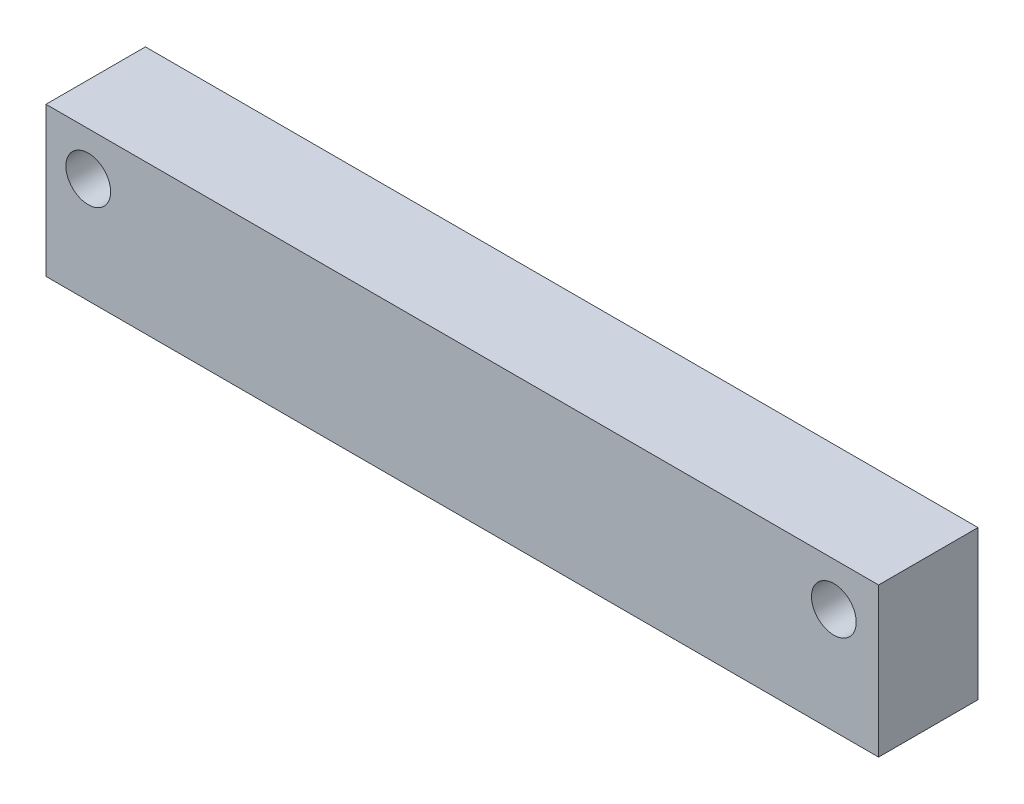
ISO-10303-21;
HEADER;
FILE_DESCRIPTION(('STEP AP214'),'2;1');
FILE_NAME('part.step','',(''),(''),'','','');
FILE_SCHEMA(('AUTOMOTIVE_DESIGN { 1 0 10303 214 1 1 1 1 }'));
ENDSEC;
DATA;
#1=APPLICATION_CONTEXT('core data for automotive mechanical design processes');
#2=APPLICATION_PROTOCOL_DEFINITION('international standard','automotive_design',2000,#1);
#3=PRODUCT_CONTEXT('',#1,'mechanical');
#4=PRODUCT('Part','Part','',(#3));
#5=PRODUCT_RELATED_PRODUCT_CATEGORY('part','',(#4));
#6=PRODUCT_DEFINITION_FORMATION('','',#4);
#7=PRODUCT_DEFINITION_CONTEXT('part definition',#1,'design');
#8=PRODUCT_DEFINITION('design','',#6,#7);
#9=PRODUCT_DEFINITION_SHAPE('','',#8);
#10=(LENGTH_UNIT() NAMED_UNIT(*) SI_UNIT(.MILLI.,.METRE.));
#11=(NAMED_UNIT(*) PLANE_ANGLE_UNIT() SI_UNIT($,.RADIAN.));
#12=(NAMED_UNIT(*) SI_UNIT($,.STERADIAN.) SOLID_ANGLE_UNIT());
#13=UNCERTAINTY_MEASURE_WITH_UNIT(LENGTH_MEASURE(1.E-05),#10,'distance_accuracy_value','');
#14=(GEOMETRIC_REPRESENTATION_CONTEXT(3) GLOBAL_UNCERTAINTY_ASSIGNED_CONTEXT((#13)) GLOBAL_UNIT_ASSIGNED_CONTEXT((#10,
#11,#12)) REPRESENTATION_CONTEXT('',''));
#15=CARTESIAN_POINT('',(0.,0.,0.));
#16=DIRECTION('',(0.,0.,1.));
#17=DIRECTION('',(1.,0.,0.));
#18=AXIS2_PLACEMENT_3D('',#15,#16,#17);
#19=CARTESIAN_POINT('',(0.,38.5000000000009,76.0661442683266));
#20=DIRECTION('',(0.,1.,0.));
#21=DIRECTION('',(0.,0.,1.));
#22=AXIS2_PLACEMENT_3D('',#19,#20,#21);
#23=PLANE('',#22);
#24=DIRECTION('',(1.,0.,-3.19999867644664E-09));
#25=VECTOR('',#24,1.);
#26=CARTESIAN_POINT('',(-2.17811570641216E-07,38.5000000000009,8.00000029007987));
#27=LINE('',#26,#25);
#28=CARTESIAN_POINT('',(67.3500000304,38.5000000000009,8.00000007455997));
#29=VERTEX_POINT('',#28);
#30=CARTESIAN_POINT('',(134.3500000304,38.5000000000009,7.99999986016006));
#31=VERTEX_POINT('',#30);
#32=EDGE_CURVE('E98',#29,#31,#27,.T.);
#33=ORIENTED_EDGE('',*,*,#32,.F.);
#34=DIRECTION('',(0.,0.,-1.));
#35=VECTOR('',#34,1.);
#36=CARTESIAN_POINT('',(67.3500000304,38.5000000000009,76.0661442683266));
#37=LINE('',#36,#35);
#38=CARTESIAN_POINT('',(67.3500000304,38.5000000000009,0.));
#39=VERTEX_POINT('',#38);
#40=EDGE_CURVE('E51',#29,#39,#37,.T.);
#41=ORIENTED_EDGE('',*,*,#40,.T.);
#42=DIRECTION('',(1.,0.,0.));
#43=VECTOR('',#42,1.);
#44=CARTESIAN_POINT('',(0.,38.5000000000009,0.));
#45=LINE('',#44,#43);
#46=CARTESIAN_POINT('',(134.3500000304,38.5000000000009,0.));
#47=VERTEX_POINT('',#46);
#48=EDGE_CURVE('E96',#39,#47,#45,.T.);
#49=ORIENTED_EDGE('',*,*,#48,.T.);
#50=DIRECTION('',(0.,0.,-1.));
#51=VECTOR('',#50,1.);
#52=CARTESIAN_POINT('',(134.3500000304,38.5000000000009,76.0661442683266));
#53=LINE('',#52,#51);
#54=EDGE_CURVE('E87',#31,#47,#53,.T.);
#55=ORIENTED_EDGE('',*,*,#54,.F.);
#56=EDGE_LOOP('',(#33,#41,#49,#55));
#57=FACE_BOUND('',#56,.T.);
#58=ADVANCED_FACE('F47',(#57),#23,.F.);
#59=CARTESIAN_POINT('',(134.3500000304,0.,76.0661442683266));
#60=DIRECTION('',(-1.,0.,0.));
#61=DIRECTION('',(0.,0.,1.));
#62=AXIS2_PLACEMENT_3D('',#59,#60,#61);
#63=PLANE('',#62);
#64=DIRECTION('',(0.,1.,0.));
#65=VECTOR('',#64,1.);
#66=CARTESIAN_POINT('',(134.3500000304,0.,7.99999986016003));
#67=LINE('',#66,#65);
#68=CARTESIAN_POINT('',(134.3500000304,50.5000000000009,7.99999996736002));
#69=VERTEX_POINT('',#68);
#70=EDGE_CURVE('E57',#31,#69,#67,.T.);
#71=ORIENTED_EDGE('',*,*,#70,.F.);
#72=ORIENTED_EDGE('',*,*,#54,.T.);
#73=DIRECTION('',(0.,1.,0.));
#74=VECTOR('',#73,1.);
#75=CARTESIAN_POINT('',(134.3500000304,0.,0.));
#76=LINE('',#75,#74);
#77=CARTESIAN_POINT('',(134.3500000304,50.5000000000009,0.));
#78=VERTEX_POINT('',#77);
#79=EDGE_CURVE('E111',#47,#78,#76,.T.);
#80=ORIENTED_EDGE('',*,*,#79,.T.);
#81=DIRECTION('',(0.,0.,-1.));
#82=VECTOR('',#81,1.);
#83=CARTESIAN_POINT('',(134.3500000304,50.5000000000009,76.0661442683266));
#84=LINE('',#83,#82);
#85=EDGE_CURVE('E126',#69,#78,#84,.T.);
#86=ORIENTED_EDGE('',*,*,#85,.F.);
#87=EDGE_LOOP('',(#71,#72,#80,#86));
#88=FACE_BOUND('',#87,.T.);
#89=ADVANCED_FACE('F157',(#88),#63,.F.);
#90=CARTESIAN_POINT('',(0.,50.5000000000009,76.0661442683266));
#91=DIRECTION('',(0.,-1.,0.));
#92=DIRECTION('',(0.,0.,-1.));
#93=AXIS2_PLACEMENT_3D('',#90,#91,#92);
#94=PLANE('',#93);
#95=DIRECTION('',(-1.,0.,3.19999867644664E-09));
#96=VECTOR('',#95,1.);
#97=CARTESIAN_POINT('',(-2.17811570641216E-07,50.5000000000009,8.00000029007988));
#98=LINE('',#97,#96);
#99=CARTESIAN_POINT('',(67.3500000304,50.5000000000009,8.00000007455998));
#100=VERTEX_POINT('',#99);
#101=EDGE_CURVE('E11',#69,#100,#98,.T.);
#102=ORIENTED_EDGE('',*,*,#101,.F.);
#103=ORIENTED_EDGE('',*,*,#85,.T.);
#104=DIRECTION('',(-1.,0.,0.));
#105=VECTOR('',#104,1.);
#106=CARTESIAN_POINT('',(0.,50.5000000000009,0.));
#107=LINE('',#106,#105);
#108=CARTESIAN_POINT('',(67.3500000304,50.5000000000009,0.));
#109=VERTEX_POINT('',#108);
#110=EDGE_CURVE('E128',#78,#109,#107,.T.);
#111=ORIENTED_EDGE('',*,*,#110,.T.);
#112=DIRECTION('',(0.,0.,-1.));
#113=VECTOR('',#112,1.);
#114=CARTESIAN_POINT('',(67.3500000304,50.5000000000009,76.0661442683266));
#115=LINE('',#114,#113);
#116=EDGE_CURVE('E70',#100,#109,#115,.T.);
#117=ORIENTED_EDGE('',*,*,#116,.F.);
#118=EDGE_LOOP('',(#102,#103,#111,#117));
#119=FACE_BOUND('',#118,.T.);
#120=ADVANCED_FACE('F156',(#119),#94,.F.);
#121=CARTESIAN_POINT('',(67.3500000304,0.,76.0661442683266));
#122=DIRECTION('',(1.,0.,0.));
#123=DIRECTION('',(0.,0.,-1.));
#124=AXIS2_PLACEMENT_3D('',#121,#122,#123);
#125=PLANE('',#124);
#126=DIRECTION('',(0.,-1.,0.));
#127=VECTOR('',#126,1.);
#128=CARTESIAN_POINT('',(67.3500000304,0.,8.00000007455995));
#129=LINE('',#128,#127);
#130=EDGE_CURVE('E108',#100,#29,#129,.T.);
#131=ORIENTED_EDGE('',*,*,#130,.F.);
#132=ORIENTED_EDGE('',*,*,#116,.T.);
#133=DIRECTION('',(0.,-1.,0.));
#134=VECTOR('',#133,1.);
#135=CARTESIAN_POINT('',(67.3500000304,0.,0.));
#136=LINE('',#135,#134);
#137=EDGE_CURVE('E103',#109,#39,#136,.T.);
#138=ORIENTED_EDGE('',*,*,#137,.T.);
#139=ORIENTED_EDGE('',*,*,#40,.F.);
#140=EDGE_LOOP('',(#131,#132,#138,#139));
#141=FACE_BOUND('',#140,.T.);
#142=ADVANCED_FACE('F104',(#141),#125,.F.);
#143=CARTESIAN_POINT('',(0.,0.,0.));
#144=DIRECTION('',(0.,0.,1.));
#145=DIRECTION('',(1.,0.,0.));
#146=AXIS2_PLACEMENT_3D('',#143,#144,#145);
#147=PLANE('',#146);
#148=CARTESIAN_POINT('',(70.7500000159984,47.0000000000009,-1.08799982911911E-08));
#149=DIRECTION('',(3.19999867644664E-09,0.,1.));
#150=DIRECTION('',(1.,0.,-3.19999867644664E-09));
#151=AXIS2_PLACEMENT_3D('',#148,#149,#150);
#152=CIRCLE('',#151,1.8);
#153=CARTESIAN_POINT('',(72.5500000159984,47.0000000000009,-1.66399959087951E-08));
#154=VERTEX_POINT('',#153);
#155=EDGE_CURVE('E141',#154,#154,#152,.T.);
#156=ORIENTED_EDGE('',*,*,#155,.T.);
#157=EDGE_LOOP('',(#156));
#158=FACE_BOUND('',#157,.T.);
#159=CARTESIAN_POINT('',(130.750000015998,47.0000000000021,-2.02879917726717E-07));
#160=DIRECTION('',(3.19999867644664E-09,0.,1.));
#161=DIRECTION('',(1.,0.,-3.19999867644664E-09));
#162=AXIS2_PLACEMENT_3D('',#159,#160,#161);
#163=CIRCLE('',#162,1.8);
#164=CARTESIAN_POINT('',(132.550000015998,47.0000000000021,-2.08639915344321E-07));
#165=VERTEX_POINT('',#164);
#166=EDGE_CURVE('E101',#165,#165,#163,.T.);
#167=ORIENTED_EDGE('',*,*,#166,.T.);
#168=EDGE_LOOP('',(#167));
#169=FACE_BOUND('',#168,.T.);
#170=ORIENTED_EDGE('',*,*,#48,.F.);
#171=ORIENTED_EDGE('',*,*,#137,.F.);
#172=ORIENTED_EDGE('',*,*,#110,.F.);
#173=ORIENTED_EDGE('',*,*,#79,.F.);
#174=EDGE_LOOP('',(#170,#171,#172,#173));
#175=FACE_BOUND('',#174,.T.);
#176=ADVANCED_FACE('F110',(#158,#169,#175),#147,.F.);
#177=CARTESIAN_POINT('',(80.649999968,58.4,8.00000003199999));
#178=DIRECTION('',(3.19999867644664E-09,0.,1.));
#179=DIRECTION('',(1.,0.,-3.19999867644664E-09));
#180=AXIS2_PLACEMENT_3D('',#177,#178,#179);
#181=PLANE('',#180);
#182=CARTESIAN_POINT('',(70.7500000415984,47.0000000000009,8.00000006367997));
#183=DIRECTION('',(3.19999867644664E-09,0.,1.));
#184=DIRECTION('',(1.,0.,-3.19999867644664E-09));
#185=AXIS2_PLACEMENT_3D('',#182,#183,#184);
#186=CIRCLE('',#185,1.8);
#187=CARTESIAN_POINT('',(72.5500000415984,47.0000000000009,8.00000005791997));
#188=VERTEX_POINT('',#187);
#189=EDGE_CURVE('E144',#188,#188,#186,.T.);
#190=ORIENTED_EDGE('',*,*,#189,.F.);
#191=EDGE_LOOP('',(#190));
#192=FACE_BOUND('',#191,.T.);
#193=CARTESIAN_POINT('',(130.750000041598,47.0000000000021,7.99999987168005));
#194=DIRECTION('',(3.19999867644664E-09,0.,1.));
#195=DIRECTION('',(1.,0.,-3.19999867644664E-09));
#196=AXIS2_PLACEMENT_3D('',#193,#194,#195);
#197=CIRCLE('',#196,1.8);
#198=CARTESIAN_POINT('',(132.550000041598,47.0000000000021,7.99999986592005));
#199=VERTEX_POINT('',#198);
#200=EDGE_CURVE('E137',#199,#199,#197,.T.);
#201=ORIENTED_EDGE('',*,*,#200,.F.);
#202=EDGE_LOOP('',(#201));
#203=FACE_BOUND('',#202,.T.);
#204=ORIENTED_EDGE('',*,*,#130,.T.);
#205=ORIENTED_EDGE('',*,*,#32,.T.);
#206=ORIENTED_EDGE('',*,*,#70,.T.);
#207=ORIENTED_EDGE('',*,*,#101,.T.);
#208=EDGE_LOOP('',(#204,#205,#206,#207));
#209=FACE_BOUND('',#208,.T.);
#210=ADVANCED_FACE('F49',(#192,#203,#209),#181,.T.);
#211=CARTESIAN_POINT('',(130.750000041598,47.0000000000021,7.99999987168005));
#212=DIRECTION('',(3.19999867644664E-09,0.,1.));
#213=DIRECTION('',(1.,0.,-3.19999867644664E-09));
#214=AXIS2_PLACEMENT_3D('',#211,#212,#213);
#215=CYLINDRICAL_SURFACE('',#214,1.8);
#216=ORIENTED_EDGE('',*,*,#166,.F.);
#217=EDGE_LOOP('',(#216));
#218=FACE_BOUND('',#217,.T.);
#219=ORIENTED_EDGE('',*,*,#200,.T.);
#220=EDGE_LOOP('',(#219));
#221=FACE_BOUND('',#220,.T.);
#222=ADVANCED_FACE('F153',(#218,#221),#215,.F.);
#223=CARTESIAN_POINT('',(70.7500000415984,47.0000000000009,8.00000006367997));
#224=DIRECTION('',(3.19999867644664E-09,0.,1.));
#225=DIRECTION('',(1.,0.,-3.19999867644664E-09));
#226=AXIS2_PLACEMENT_3D('',#223,#224,#225);
#227=CYLINDRICAL_SURFACE('',#226,1.8);
#228=ORIENTED_EDGE('',*,*,#155,.F.);
#229=EDGE_LOOP('',(#228));
#230=FACE_BOUND('',#229,.T.);
#231=ORIENTED_EDGE('',*,*,#189,.T.);
#232=EDGE_LOOP('',(#231));
#233=FACE_BOUND('',#232,.T.);
#234=ADVANCED_FACE('F149',(#230,#233),#227,.F.);
#235=CLOSED_SHELL('',(#58,#89,#120,#142,#176,#210,#222,#234));
#236=MANIFOLD_SOLID_BREP('B2',#235);
#237=ADVANCED_BREP_SHAPE_REPRESENTATION('',(#18,#236),#14);
#238=SHAPE_DEFINITION_REPRESENTATION(#9,#237);
ENDSEC;
END-ISO-10303-21;
